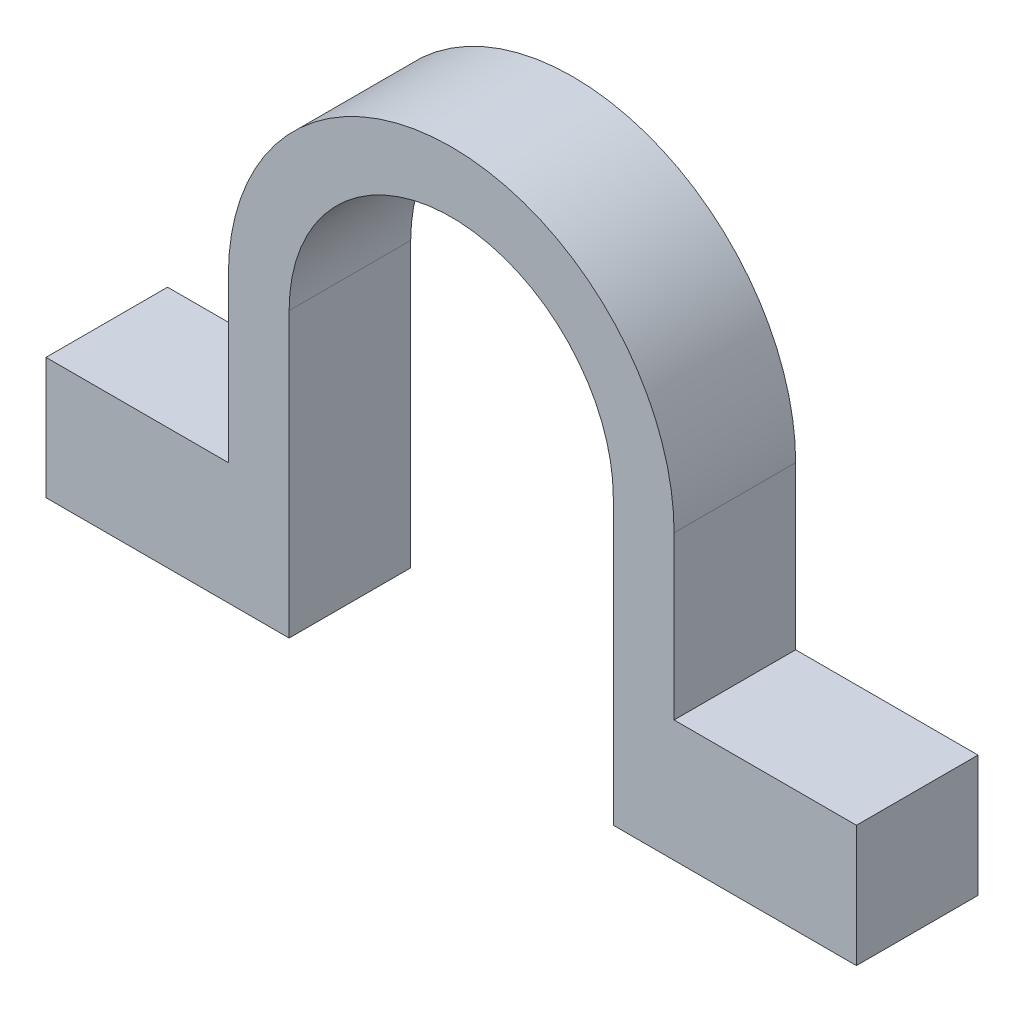
ISO-10303-21;
HEADER;
FILE_DESCRIPTION(('STEP AP214'),'2;1');
FILE_NAME('part.step','',(''),(''),'','','');
FILE_SCHEMA(('AUTOMOTIVE_DESIGN { 1 0 10303 214 1 1 1 1 }'));
ENDSEC;
DATA;
#1=APPLICATION_CONTEXT('core data for automotive mechanical design processes');
#2=APPLICATION_PROTOCOL_DEFINITION('international standard','automotive_design',2000,#1);
#3=PRODUCT_CONTEXT('',#1,'mechanical');
#4=PRODUCT('Part','Part','',(#3));
#5=PRODUCT_RELATED_PRODUCT_CATEGORY('part','',(#4));
#6=PRODUCT_DEFINITION_FORMATION('','',#4);
#7=PRODUCT_DEFINITION_CONTEXT('part definition',#1,'design');
#8=PRODUCT_DEFINITION('design','',#6,#7);
#9=PRODUCT_DEFINITION_SHAPE('','',#8);
#10=(LENGTH_UNIT() NAMED_UNIT(*) SI_UNIT(.MILLI.,.METRE.));
#11=(NAMED_UNIT(*) PLANE_ANGLE_UNIT() SI_UNIT($,.RADIAN.));
#12=(NAMED_UNIT(*) SI_UNIT($,.STERADIAN.) SOLID_ANGLE_UNIT());
#13=UNCERTAINTY_MEASURE_WITH_UNIT(LENGTH_MEASURE(1.E-05),#10,'distance_accuracy_value','');
#14=(GEOMETRIC_REPRESENTATION_CONTEXT(3) GLOBAL_UNCERTAINTY_ASSIGNED_CONTEXT((#13)) GLOBAL_UNIT_ASSIGNED_CONTEXT((#10,
#11,#12)) REPRESENTATION_CONTEXT('',''));
#15=CARTESIAN_POINT('',(0.,0.,0.));
#16=DIRECTION('',(0.,0.,1.));
#17=DIRECTION('',(1.,0.,0.));
#18=AXIS2_PLACEMENT_3D('',#15,#16,#17);
#19=CARTESIAN_POINT('',(0.,0.,3.));
#20=DIRECTION('',(0.,0.,-1.));
#21=DIRECTION('',(-1.,0.,0.));
#22=AXIS2_PLACEMENT_3D('',#19,#20,#21);
#23=CYLINDRICAL_SURFACE('',#22,4.);
#24=CARTESIAN_POINT('',(0.,0.,0.));
#25=DIRECTION('',(0.,0.,-1.));
#26=DIRECTION('',(1.,0.,0.));
#27=AXIS2_PLACEMENT_3D('',#24,#25,#26);
#28=CIRCLE('',#27,4.);
#29=CARTESIAN_POINT('',(-4.,0.,0.));
#30=VERTEX_POINT('',#29);
#31=CARTESIAN_POINT('',(4.,0.,0.));
#32=VERTEX_POINT('',#31);
#33=EDGE_CURVE('E164',#30,#32,#28,.T.);
#34=ORIENTED_EDGE('',*,*,#33,.T.);
#35=DIRECTION('',(0.,0.,-1.));
#36=VECTOR('',#35,1.);
#37=CARTESIAN_POINT('',(4.,0.,3.));
#38=LINE('',#37,#36);
#39=CARTESIAN_POINT('',(4.,0.,3.));
#40=VERTEX_POINT('',#39);
#41=EDGE_CURVE('E11',#40,#32,#38,.T.);
#42=ORIENTED_EDGE('',*,*,#41,.F.);
#43=CARTESIAN_POINT('',(0.,0.,3.));
#44=DIRECTION('',(0.,0.,-1.));
#45=DIRECTION('',(1.,0.,0.));
#46=AXIS2_PLACEMENT_3D('',#43,#44,#45);
#47=CIRCLE('',#46,4.);
#48=CARTESIAN_POINT('',(-4.,0.,3.));
#49=VERTEX_POINT('',#48);
#50=EDGE_CURVE('E198',#49,#40,#47,.T.);
#51=ORIENTED_EDGE('',*,*,#50,.F.);
#52=DIRECTION('',(0.,0.,-1.));
#53=VECTOR('',#52,1.);
#54=CARTESIAN_POINT('',(-4.,0.,3.));
#55=LINE('',#54,#53);
#56=EDGE_CURVE('E160',#49,#30,#55,.T.);
#57=ORIENTED_EDGE('',*,*,#56,.T.);
#58=EDGE_LOOP('',(#34,#42,#51,#57));
#59=FACE_BOUND('',#58,.T.);
#60=ADVANCED_FACE('F39',(#59),#23,.F.);
#61=CARTESIAN_POINT('',(4.,0.,3.));
#62=DIRECTION('',(1.,0.,0.));
#63=DIRECTION('',(0.,1.,0.));
#64=AXIS2_PLACEMENT_3D('',#61,#62,#63);
#65=PLANE('',#64);
#66=DIRECTION('',(0.,-1.,0.));
#67=VECTOR('',#66,1.);
#68=CARTESIAN_POINT('',(4.,0.,0.));
#69=LINE('',#68,#67);
#70=CARTESIAN_POINT('',(4.,-7.,0.));
#71=VERTEX_POINT('',#70);
#72=EDGE_CURVE('E168',#32,#71,#69,.T.);
#73=ORIENTED_EDGE('',*,*,#72,.T.);
#74=DIRECTION('',(0.,0.,-1.));
#75=VECTOR('',#74,1.);
#76=CARTESIAN_POINT('',(4.,-7.,3.));
#77=LINE('',#76,#75);
#78=CARTESIAN_POINT('',(4.,-7.,3.));
#79=VERTEX_POINT('',#78);
#80=EDGE_CURVE('E48',#79,#71,#77,.T.);
#81=ORIENTED_EDGE('',*,*,#80,.F.);
#82=DIRECTION('',(0.,-1.,0.));
#83=VECTOR('',#82,1.);
#84=CARTESIAN_POINT('',(4.,0.,3.));
#85=LINE('',#84,#83);
#86=EDGE_CURVE('E111',#40,#79,#85,.T.);
#87=ORIENTED_EDGE('',*,*,#86,.F.);
#88=ORIENTED_EDGE('',*,*,#41,.T.);
#89=EDGE_LOOP('',(#73,#81,#87,#88));
#90=FACE_BOUND('',#89,.T.);
#91=ADVANCED_FACE('F292',(#90),#65,.F.);
#92=CARTESIAN_POINT('',(10.,-7.,3.));
#93=DIRECTION('',(0.,1.,0.));
#94=DIRECTION('',(-1.,0.,0.));
#95=AXIS2_PLACEMENT_3D('',#92,#93,#94);
#96=PLANE('',#95);
#97=DIRECTION('',(1.,0.,0.));
#98=VECTOR('',#97,1.);
#99=CARTESIAN_POINT('',(10.,-7.,0.));
#100=LINE('',#99,#98);
#101=CARTESIAN_POINT('',(10.,-7.,0.));
#102=VERTEX_POINT('',#101);
#103=EDGE_CURVE('E171',#71,#102,#100,.T.);
#104=ORIENTED_EDGE('',*,*,#103,.T.);
#105=DIRECTION('',(0.,0.,-1.));
#106=VECTOR('',#105,1.);
#107=CARTESIAN_POINT('',(10.,-7.,3.));
#108=LINE('',#107,#106);
#109=CARTESIAN_POINT('',(10.,-7.,3.));
#110=VERTEX_POINT('',#109);
#111=EDGE_CURVE('E225',#110,#102,#108,.T.);
#112=ORIENTED_EDGE('',*,*,#111,.F.);
#113=DIRECTION('',(1.,0.,0.));
#114=VECTOR('',#113,1.);
#115=CARTESIAN_POINT('',(10.,-7.,3.));
#116=LINE('',#115,#114);
#117=EDGE_CURVE('E235',#79,#110,#116,.T.);
#118=ORIENTED_EDGE('',*,*,#117,.F.);
#119=ORIENTED_EDGE('',*,*,#80,.T.);
#120=EDGE_LOOP('',(#104,#112,#118,#119));
#121=FACE_BOUND('',#120,.T.);
#122=ADVANCED_FACE('F233',(#121),#96,.F.);
#123=CARTESIAN_POINT('',(10.,-4.,3.));
#124=DIRECTION('',(-1.,0.,0.));
#125=DIRECTION('',(0.,0.,1.));
#126=AXIS2_PLACEMENT_3D('',#123,#124,#125);
#127=PLANE('',#126);
#128=DIRECTION('',(0.,1.,0.));
#129=VECTOR('',#128,1.);
#130=CARTESIAN_POINT('',(10.,-4.,0.));
#131=LINE('',#130,#129);
#132=CARTESIAN_POINT('',(10.,-4.,0.));
#133=VERTEX_POINT('',#132);
#134=EDGE_CURVE('E174',#102,#133,#131,.T.);
#135=ORIENTED_EDGE('',*,*,#134,.T.);
#136=DIRECTION('',(0.,0.,-1.));
#137=VECTOR('',#136,1.);
#138=CARTESIAN_POINT('',(10.,-4.,3.));
#139=LINE('',#138,#137);
#140=CARTESIAN_POINT('',(10.,-4.,3.));
#141=VERTEX_POINT('',#140);
#142=EDGE_CURVE('E221',#141,#133,#139,.T.);
#143=ORIENTED_EDGE('',*,*,#142,.F.);
#144=DIRECTION('',(0.,1.,0.));
#145=VECTOR('',#144,1.);
#146=CARTESIAN_POINT('',(10.,-4.,3.));
#147=LINE('',#146,#145);
#148=EDGE_CURVE('E254',#110,#141,#147,.T.);
#149=ORIENTED_EDGE('',*,*,#148,.F.);
#150=ORIENTED_EDGE('',*,*,#111,.T.);
#151=EDGE_LOOP('',(#135,#143,#149,#150));
#152=FACE_BOUND('',#151,.T.);
#153=ADVANCED_FACE('F244',(#152),#127,.F.);
#154=CARTESIAN_POINT('',(5.5,-4.,3.));
#155=DIRECTION('',(0.,-1.,0.));
#156=DIRECTION('',(0.,0.,-1.));
#157=AXIS2_PLACEMENT_3D('',#154,#155,#156);
#158=PLANE('',#157);
#159=DIRECTION('',(-1.,0.,0.));
#160=VECTOR('',#159,1.);
#161=CARTESIAN_POINT('',(5.5,-4.,0.));
#162=LINE('',#161,#160);
#163=CARTESIAN_POINT('',(5.5,-4.,0.));
#164=VERTEX_POINT('',#163);
#165=EDGE_CURVE('E177',#133,#164,#162,.T.);
#166=ORIENTED_EDGE('',*,*,#165,.T.);
#167=DIRECTION('',(0.,0.,-1.));
#168=VECTOR('',#167,1.);
#169=CARTESIAN_POINT('',(5.5,-4.,3.));
#170=LINE('',#169,#168);
#171=CARTESIAN_POINT('',(5.5,-4.,3.));
#172=VERTEX_POINT('',#171);
#173=EDGE_CURVE('E217',#172,#164,#170,.T.);
#174=ORIENTED_EDGE('',*,*,#173,.F.);
#175=DIRECTION('',(-1.,0.,0.));
#176=VECTOR('',#175,1.);
#177=CARTESIAN_POINT('',(5.5,-4.,3.));
#178=LINE('',#177,#176);
#179=EDGE_CURVE('E250',#141,#172,#178,.T.);
#180=ORIENTED_EDGE('',*,*,#179,.F.);
#181=ORIENTED_EDGE('',*,*,#142,.T.);
#182=EDGE_LOOP('',(#166,#174,#180,#181));
#183=FACE_BOUND('',#182,.T.);
#184=ADVANCED_FACE('F248',(#183),#158,.F.);
#185=CARTESIAN_POINT('',(5.5,0.,3.));
#186=DIRECTION('',(-1.,0.,0.));
#187=DIRECTION('',(0.,0.,1.));
#188=AXIS2_PLACEMENT_3D('',#185,#186,#187);
#189=PLANE('',#188);
#190=DIRECTION('',(0.,1.,0.));
#191=VECTOR('',#190,1.);
#192=CARTESIAN_POINT('',(5.5,0.,0.));
#193=LINE('',#192,#191);
#194=CARTESIAN_POINT('',(5.5,0.,0.));
#195=VERTEX_POINT('',#194);
#196=EDGE_CURVE('E180',#164,#195,#193,.T.);
#197=ORIENTED_EDGE('',*,*,#196,.T.);
#198=DIRECTION('',(0.,0.,-1.));
#199=VECTOR('',#198,1.);
#200=CARTESIAN_POINT('',(5.5,0.,3.));
#201=LINE('',#200,#199);
#202=CARTESIAN_POINT('',(5.5,0.,3.));
#203=VERTEX_POINT('',#202);
#204=EDGE_CURVE('E213',#203,#195,#201,.T.);
#205=ORIENTED_EDGE('',*,*,#204,.F.);
#206=DIRECTION('',(0.,1.,0.));
#207=VECTOR('',#206,1.);
#208=CARTESIAN_POINT('',(5.5,0.,3.));
#209=LINE('',#208,#207);
#210=EDGE_CURVE('E253',#172,#203,#209,.T.);
#211=ORIENTED_EDGE('',*,*,#210,.F.);
#212=ORIENTED_EDGE('',*,*,#173,.T.);
#213=EDGE_LOOP('',(#197,#205,#211,#212));
#214=FACE_BOUND('',#213,.T.);
#215=ADVANCED_FACE('F305',(#214),#189,.F.);
#216=CARTESIAN_POINT('',(0.,0.,3.));
#217=DIRECTION('',(0.,0.,-1.));
#218=DIRECTION('',(-1.,0.,0.));
#219=AXIS2_PLACEMENT_3D('',#216,#217,#218);
#220=CYLINDRICAL_SURFACE('',#219,5.5);
#221=CARTESIAN_POINT('',(0.,0.,0.));
#222=DIRECTION('',(0.,0.,1.));
#223=DIRECTION('',(1.,0.,0.));
#224=AXIS2_PLACEMENT_3D('',#221,#222,#223);
#225=CIRCLE('',#224,5.5);
#226=CARTESIAN_POINT('',(-5.5,0.,0.));
#227=VERTEX_POINT('',#226);
#228=EDGE_CURVE('E183',#195,#227,#225,.T.);
#229=ORIENTED_EDGE('',*,*,#228,.T.);
#230=DIRECTION('',(0.,0.,-1.));
#231=VECTOR('',#230,1.);
#232=CARTESIAN_POINT('',(-5.5,0.,3.));
#233=LINE('',#232,#231);
#234=CARTESIAN_POINT('',(-5.5,0.,3.));
#235=VERTEX_POINT('',#234);
#236=EDGE_CURVE('E209',#235,#227,#233,.T.);
#237=ORIENTED_EDGE('',*,*,#236,.F.);
#238=CARTESIAN_POINT('',(0.,0.,3.));
#239=DIRECTION('',(0.,0.,1.));
#240=DIRECTION('',(1.,0.,0.));
#241=AXIS2_PLACEMENT_3D('',#238,#239,#240);
#242=CIRCLE('',#241,5.5);
#243=EDGE_CURVE('E258',#203,#235,#242,.T.);
#244=ORIENTED_EDGE('',*,*,#243,.F.);
#245=ORIENTED_EDGE('',*,*,#204,.T.);
#246=EDGE_LOOP('',(#229,#237,#244,#245));
#247=FACE_BOUND('',#246,.T.);
#248=ADVANCED_FACE('F308',(#247),#220,.T.);
#249=CARTESIAN_POINT('',(-5.5,0.,3.));
#250=DIRECTION('',(1.,0.,0.));
#251=DIRECTION('',(0.,0.,-1.));
#252=AXIS2_PLACEMENT_3D('',#249,#250,#251);
#253=PLANE('',#252);
#254=DIRECTION('',(0.,-1.,0.));
#255=VECTOR('',#254,1.);
#256=CARTESIAN_POINT('',(-5.5,0.,0.));
#257=LINE('',#256,#255);
#258=CARTESIAN_POINT('',(-5.5,-4.,0.));
#259=VERTEX_POINT('',#258);
#260=EDGE_CURVE('E186',#227,#259,#257,.T.);
#261=ORIENTED_EDGE('',*,*,#260,.T.);
#262=DIRECTION('',(0.,0.,-1.));
#263=VECTOR('',#262,1.);
#264=CARTESIAN_POINT('',(-5.5,-4.,3.));
#265=LINE('',#264,#263);
#266=CARTESIAN_POINT('',(-5.5,-4.,3.));
#267=VERTEX_POINT('',#266);
#268=EDGE_CURVE('E205',#267,#259,#265,.T.);
#269=ORIENTED_EDGE('',*,*,#268,.F.);
#270=DIRECTION('',(0.,-1.,0.));
#271=VECTOR('',#270,1.);
#272=CARTESIAN_POINT('',(-5.5,0.,3.));
#273=LINE('',#272,#271);
#274=EDGE_CURVE('E265',#235,#267,#273,.T.);
#275=ORIENTED_EDGE('',*,*,#274,.F.);
#276=ORIENTED_EDGE('',*,*,#236,.T.);
#277=EDGE_LOOP('',(#261,#269,#275,#276));
#278=FACE_BOUND('',#277,.T.);
#279=ADVANCED_FACE('F273',(#278),#253,.F.);
#280=CARTESIAN_POINT('',(-5.5,-4.,3.));
#281=DIRECTION('',(0.,-1.,0.));
#282=DIRECTION('',(1.,0.,0.));
#283=AXIS2_PLACEMENT_3D('',#280,#281,#282);
#284=PLANE('',#283);
#285=DIRECTION('',(-1.,0.,0.));
#286=VECTOR('',#285,1.);
#287=CARTESIAN_POINT('',(-5.5,-4.,0.));
#288=LINE('',#287,#286);
#289=CARTESIAN_POINT('',(-10.,-4.,0.));
#290=VERTEX_POINT('',#289);
#291=EDGE_CURVE('E189',#259,#290,#288,.T.);
#292=ORIENTED_EDGE('',*,*,#291,.T.);
#293=DIRECTION('',(0.,0.,-1.));
#294=VECTOR('',#293,1.);
#295=CARTESIAN_POINT('',(-10.,-4.,3.));
#296=LINE('',#295,#294);
#297=CARTESIAN_POINT('',(-10.,-4.,3.));
#298=VERTEX_POINT('',#297);
#299=EDGE_CURVE('E153',#298,#290,#296,.T.);
#300=ORIENTED_EDGE('',*,*,#299,.F.);
#301=DIRECTION('',(-1.,0.,0.));
#302=VECTOR('',#301,1.);
#303=CARTESIAN_POINT('',(-5.5,-4.,3.));
#304=LINE('',#303,#302);
#305=EDGE_CURVE('E142',#267,#298,#304,.T.);
#306=ORIENTED_EDGE('',*,*,#305,.F.);
#307=ORIENTED_EDGE('',*,*,#268,.T.);
#308=EDGE_LOOP('',(#292,#300,#306,#307));
#309=FACE_BOUND('',#308,.T.);
#310=ADVANCED_FACE('F277',(#309),#284,.F.);
#311=CARTESIAN_POINT('',(-10.,-4.,3.));
#312=DIRECTION('',(1.,0.,0.));
#313=DIRECTION('',(0.,0.,-1.));
#314=AXIS2_PLACEMENT_3D('',#311,#312,#313);
#315=PLANE('',#314);
#316=DIRECTION('',(0.,-1.,0.));
#317=VECTOR('',#316,1.);
#318=CARTESIAN_POINT('',(-10.,-4.,0.));
#319=LINE('',#318,#317);
#320=CARTESIAN_POINT('',(-10.,-7.,0.));
#321=VERTEX_POINT('',#320);
#322=EDGE_CURVE('E151',#290,#321,#319,.T.);
#323=ORIENTED_EDGE('',*,*,#322,.T.);
#324=DIRECTION('',(0.,0.,-1.));
#325=VECTOR('',#324,1.);
#326=CARTESIAN_POINT('',(-10.,-7.,3.));
#327=LINE('',#326,#325);
#328=CARTESIAN_POINT('',(-10.,-7.,3.));
#329=VERTEX_POINT('',#328);
#330=EDGE_CURVE('E148',#329,#321,#327,.T.);
#331=ORIENTED_EDGE('',*,*,#330,.F.);
#332=DIRECTION('',(0.,-1.,0.));
#333=VECTOR('',#332,1.);
#334=CARTESIAN_POINT('',(-10.,-4.,3.));
#335=LINE('',#334,#333);
#336=EDGE_CURVE('E136',#298,#329,#335,.T.);
#337=ORIENTED_EDGE('',*,*,#336,.F.);
#338=ORIENTED_EDGE('',*,*,#299,.T.);
#339=EDGE_LOOP('',(#323,#331,#337,#338));
#340=FACE_BOUND('',#339,.T.);
#341=ADVANCED_FACE('F149',(#340),#315,.F.);
#342=CARTESIAN_POINT('',(-10.,-7.,3.));
#343=DIRECTION('',(0.,1.,0.));
#344=DIRECTION('',(0.,0.,1.));
#345=AXIS2_PLACEMENT_3D('',#342,#343,#344);
#346=PLANE('',#345);
#347=DIRECTION('',(1.,0.,0.));
#348=VECTOR('',#347,1.);
#349=CARTESIAN_POINT('',(-10.,-7.,0.));
#350=LINE('',#349,#348);
#351=CARTESIAN_POINT('',(-4.,-7.,0.));
#352=VERTEX_POINT('',#351);
#353=EDGE_CURVE('E97',#321,#352,#350,.T.);
#354=ORIENTED_EDGE('',*,*,#353,.T.);
#355=DIRECTION('',(0.,0.,-1.));
#356=VECTOR('',#355,1.);
#357=CARTESIAN_POINT('',(-4.,-7.,3.));
#358=LINE('',#357,#356);
#359=CARTESIAN_POINT('',(-4.,-7.,3.));
#360=VERTEX_POINT('',#359);
#361=EDGE_CURVE('E154',#360,#352,#358,.T.);
#362=ORIENTED_EDGE('',*,*,#361,.F.);
#363=DIRECTION('',(1.,0.,0.));
#364=VECTOR('',#363,1.);
#365=CARTESIAN_POINT('',(-10.,-7.,3.));
#366=LINE('',#365,#364);
#367=EDGE_CURVE('E140',#329,#360,#366,.T.);
#368=ORIENTED_EDGE('',*,*,#367,.F.);
#369=ORIENTED_EDGE('',*,*,#330,.T.);
#370=EDGE_LOOP('',(#354,#362,#368,#369));
#371=FACE_BOUND('',#370,.T.);
#372=ADVANCED_FACE('F156',(#371),#346,.F.);
#373=CARTESIAN_POINT('',(-4.,0.,3.));
#374=DIRECTION('',(-1.,0.,0.));
#375=DIRECTION('',(0.,-1.,0.));
#376=AXIS2_PLACEMENT_3D('',#373,#374,#375);
#377=PLANE('',#376);
#378=DIRECTION('',(0.,1.,0.));
#379=VECTOR('',#378,1.);
#380=CARTESIAN_POINT('',(-4.,0.,0.));
#381=LINE('',#380,#379);
#382=EDGE_CURVE('E103',#352,#30,#381,.T.);
#383=ORIENTED_EDGE('',*,*,#382,.T.);
#384=ORIENTED_EDGE('',*,*,#56,.F.);
#385=DIRECTION('',(0.,1.,0.));
#386=VECTOR('',#385,1.);
#387=CARTESIAN_POINT('',(-4.,0.,3.));
#388=LINE('',#387,#386);
#389=EDGE_CURVE('E56',#360,#49,#388,.T.);
#390=ORIENTED_EDGE('',*,*,#389,.F.);
#391=ORIENTED_EDGE('',*,*,#361,.T.);
#392=EDGE_LOOP('',(#383,#384,#390,#391));
#393=FACE_BOUND('',#392,.T.);
#394=ADVANCED_FACE('F281',(#393),#377,.F.);
#395=CARTESIAN_POINT('',(0.,0.,3.));
#396=DIRECTION('',(0.,0.,1.));
#397=DIRECTION('',(1.,0.,0.));
#398=AXIS2_PLACEMENT_3D('',#395,#396,#397);
#399=PLANE('',#398);
#400=ORIENTED_EDGE('',*,*,#50,.T.);
#401=ORIENTED_EDGE('',*,*,#86,.T.);
#402=ORIENTED_EDGE('',*,*,#117,.T.);
#403=ORIENTED_EDGE('',*,*,#148,.T.);
#404=ORIENTED_EDGE('',*,*,#179,.T.);
#405=ORIENTED_EDGE('',*,*,#210,.T.);
#406=ORIENTED_EDGE('',*,*,#243,.T.);
#407=ORIENTED_EDGE('',*,*,#274,.T.);
#408=ORIENTED_EDGE('',*,*,#305,.T.);
#409=ORIENTED_EDGE('',*,*,#336,.T.);
#410=ORIENTED_EDGE('',*,*,#367,.T.);
#411=ORIENTED_EDGE('',*,*,#389,.T.);
#412=EDGE_LOOP('',(#400,#401,#402,#403,#404,#405,#406,#407,#408,#409,#410,#411));
#413=FACE_BOUND('',#412,.T.);
#414=ADVANCED_FACE('F138',(#413),#399,.T.);
#415=CARTESIAN_POINT('',(0.,0.,0.));
#416=DIRECTION('',(0.,0.,1.));
#417=DIRECTION('',(1.,0.,0.));
#418=AXIS2_PLACEMENT_3D('',#415,#416,#417);
#419=PLANE('',#418);
#420=ORIENTED_EDGE('',*,*,#33,.F.);
#421=ORIENTED_EDGE('',*,*,#382,.F.);
#422=ORIENTED_EDGE('',*,*,#353,.F.);
#423=ORIENTED_EDGE('',*,*,#322,.F.);
#424=ORIENTED_EDGE('',*,*,#291,.F.);
#425=ORIENTED_EDGE('',*,*,#260,.F.);
#426=ORIENTED_EDGE('',*,*,#228,.F.);
#427=ORIENTED_EDGE('',*,*,#196,.F.);
#428=ORIENTED_EDGE('',*,*,#165,.F.);
#429=ORIENTED_EDGE('',*,*,#134,.F.);
#430=ORIENTED_EDGE('',*,*,#103,.F.);
#431=ORIENTED_EDGE('',*,*,#72,.F.);
#432=EDGE_LOOP('',(#420,#421,#422,#423,#424,#425,#426,#427,#428,#429,#430,#431));
#433=FACE_BOUND('',#432,.T.);
#434=ADVANCED_FACE('F239',(#433),#419,.F.);
#435=CLOSED_SHELL('',(#60,#91,#122,#153,#184,#215,#248,#279,#310,#341,#372,#394,#414,#434));
#436=MANIFOLD_SOLID_BREP('B2',#435);
#437=ADVANCED_BREP_SHAPE_REPRESENTATION('',(#18,#436),#14);
#438=SHAPE_DEFINITION_REPRESENTATION(#9,#437);
ENDSEC;
END-ISO-10303-21;
